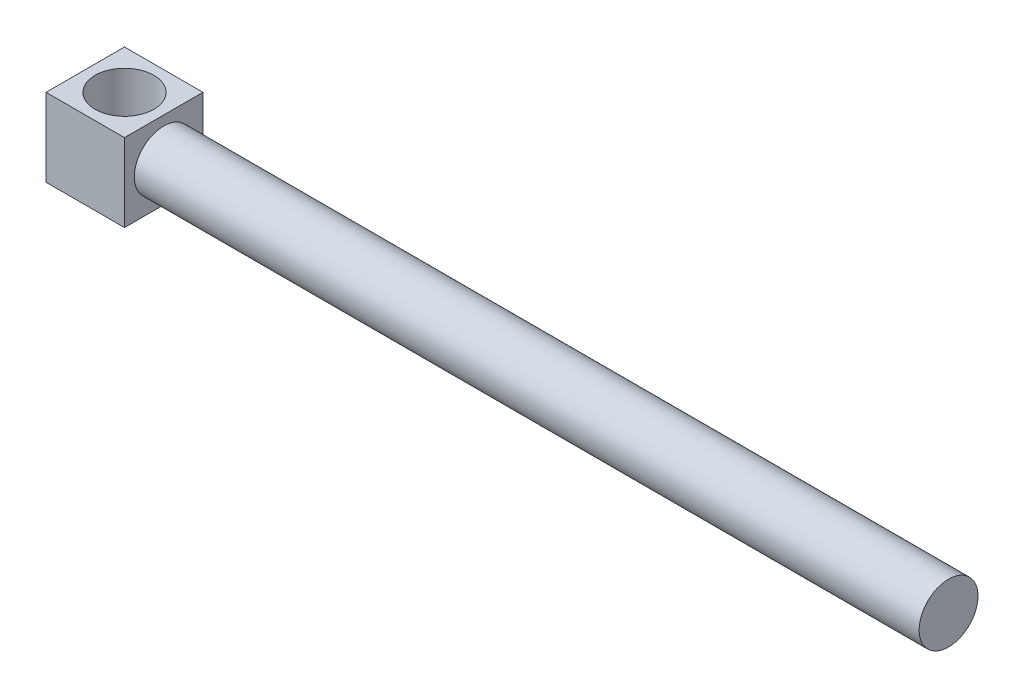
ISO-10303-21;
HEADER;
FILE_DESCRIPTION(('STEP AP214'),'2;1');
FILE_NAME('part.step','',(''),(''),'','','');
FILE_SCHEMA(('AUTOMOTIVE_DESIGN { 1 0 10303 214 1 1 1 1 }'));
ENDSEC;
DATA;
#1=APPLICATION_CONTEXT('core data for automotive mechanical design processes');
#2=APPLICATION_PROTOCOL_DEFINITION('international standard','automotive_design',2000,#1);
#3=PRODUCT_CONTEXT('',#1,'mechanical');
#4=PRODUCT('Part','Part','',(#3));
#5=PRODUCT_RELATED_PRODUCT_CATEGORY('part','',(#4));
#6=PRODUCT_DEFINITION_FORMATION('','',#4);
#7=PRODUCT_DEFINITION_CONTEXT('part definition',#1,'design');
#8=PRODUCT_DEFINITION('design','',#6,#7);
#9=PRODUCT_DEFINITION_SHAPE('','',#8);
#10=(LENGTH_UNIT() NAMED_UNIT(*) SI_UNIT(.MILLI.,.METRE.));
#11=(NAMED_UNIT(*) PLANE_ANGLE_UNIT() SI_UNIT($,.RADIAN.));
#12=(NAMED_UNIT(*) SI_UNIT($,.STERADIAN.) SOLID_ANGLE_UNIT());
#13=UNCERTAINTY_MEASURE_WITH_UNIT(LENGTH_MEASURE(1.E-05),#10,'distance_accuracy_value','');
#14=(GEOMETRIC_REPRESENTATION_CONTEXT(3) GLOBAL_UNCERTAINTY_ASSIGNED_CONTEXT((#13)) GLOBAL_UNIT_ASSIGNED_CONTEXT((#10,
#11,#12)) REPRESENTATION_CONTEXT('',''));
#15=CARTESIAN_POINT('',(0.,0.,0.));
#16=DIRECTION('',(0.,0.,1.));
#17=DIRECTION('',(1.,0.,0.));
#18=AXIS2_PLACEMENT_3D('',#15,#16,#17);
#19=CARTESIAN_POINT('',(20.,0.,0.));
#20=DIRECTION('',(0.,0.,1.));
#21=DIRECTION('',(1.,0.,0.));
#22=AXIS2_PLACEMENT_3D('',#19,#20,#21);
#23=PLANE('',#22);
#24=DIRECTION('',(0.,1.,0.));
#25=VECTOR('',#24,1.);
#26=CARTESIAN_POINT('',(0.,0.,0.));
#27=LINE('',#26,#25);
#28=CARTESIAN_POINT('',(0.,0.,0.));
#29=VERTEX_POINT('',#28);
#30=CARTESIAN_POINT('',(0.,19.8521139898844,0.));
#31=VERTEX_POINT('',#30);
#32=EDGE_CURVE('E107',#29,#31,#27,.T.);
#33=ORIENTED_EDGE('',*,*,#32,.F.);
#34=DIRECTION('',(-1.,0.,0.));
#35=VECTOR('',#34,1.);
#36=CARTESIAN_POINT('',(20.,0.,0.));
#37=LINE('',#36,#35);
#38=CARTESIAN_POINT('',(20.,0.,0.));
#39=VERTEX_POINT('',#38);
#40=EDGE_CURVE('E48',#39,#29,#37,.T.);
#41=ORIENTED_EDGE('',*,*,#40,.F.);
#42=DIRECTION('',(0.,1.,0.));
#43=VECTOR('',#42,1.);
#44=CARTESIAN_POINT('',(20.,0.,0.));
#45=LINE('',#44,#43);
#46=CARTESIAN_POINT('',(20.,19.8521139898844,0.));
#47=VERTEX_POINT('',#46);
#48=EDGE_CURVE('E101',#39,#47,#45,.T.);
#49=ORIENTED_EDGE('',*,*,#48,.T.);
#50=DIRECTION('',(-1.,0.,0.));
#51=VECTOR('',#50,1.);
#52=CARTESIAN_POINT('',(20.,19.8521139898844,0.));
#53=LINE('',#52,#51);
#54=EDGE_CURVE('E42',#47,#31,#53,.T.);
#55=ORIENTED_EDGE('',*,*,#54,.T.);
#56=EDGE_LOOP('',(#33,#41,#49,#55));
#57=FACE_BOUND('',#56,.T.);
#58=ADVANCED_FACE('F39',(#57),#23,.T.);
#59=CARTESIAN_POINT('',(20.,0.,0.));
#60=DIRECTION('',(0.,1.,0.));
#61=DIRECTION('',(0.,0.,1.));
#62=AXIS2_PLACEMENT_3D('',#59,#60,#61);
#63=PLANE('',#62);
#64=CARTESIAN_POINT('',(10.,0.,-10.));
#65=DIRECTION('',(0.,1.,0.));
#66=DIRECTION('',(0.,0.,1.));
#67=AXIS2_PLACEMENT_3D('',#64,#65,#66);
#68=CIRCLE('',#67,7.5);
#69=CARTESIAN_POINT('',(10.,0.,-2.5));
#70=VERTEX_POINT('',#69);
#71=EDGE_CURVE('E111',#70,#70,#68,.T.);
#72=ORIENTED_EDGE('',*,*,#71,.T.);
#73=EDGE_LOOP('',(#72));
#74=FACE_BOUND('',#73,.T.);
#75=DIRECTION('',(0.,0.,-1.));
#76=VECTOR('',#75,1.);
#77=CARTESIAN_POINT('',(0.,0.,0.));
#78=LINE('',#77,#76);
#79=CARTESIAN_POINT('',(0.,0.,-20.));
#80=VERTEX_POINT('',#79);
#81=EDGE_CURVE('E73',#29,#80,#78,.T.);
#82=ORIENTED_EDGE('',*,*,#81,.T.);
#83=DIRECTION('',(-1.,0.,0.));
#84=VECTOR('',#83,1.);
#85=CARTESIAN_POINT('',(20.,0.,-20.));
#86=LINE('',#85,#84);
#87=CARTESIAN_POINT('',(20.,0.,-20.));
#88=VERTEX_POINT('',#87);
#89=EDGE_CURVE('E99',#88,#80,#86,.T.);
#90=ORIENTED_EDGE('',*,*,#89,.F.);
#91=DIRECTION('',(0.,0.,-1.));
#92=VECTOR('',#91,1.);
#93=CARTESIAN_POINT('',(20.,0.,0.));
#94=LINE('',#93,#92);
#95=EDGE_CURVE('E90',#39,#88,#94,.T.);
#96=ORIENTED_EDGE('',*,*,#95,.F.);
#97=ORIENTED_EDGE('',*,*,#40,.T.);
#98=EDGE_LOOP('',(#82,#90,#96,#97));
#99=FACE_BOUND('',#98,.T.);
#100=ADVANCED_FACE('F119',(#74,#99),#63,.F.);
#101=CARTESIAN_POINT('',(20.,0.,-20.));
#102=DIRECTION('',(0.,0.,1.));
#103=DIRECTION('',(1.,0.,0.));
#104=AXIS2_PLACEMENT_3D('',#101,#102,#103);
#105=PLANE('',#104);
#106=DIRECTION('',(0.,1.,0.));
#107=VECTOR('',#106,1.);
#108=CARTESIAN_POINT('',(0.,0.,-20.));
#109=LINE('',#108,#107);
#110=CARTESIAN_POINT('',(0.,19.8521139898844,-20.));
#111=VERTEX_POINT('',#110);
#112=EDGE_CURVE('E97',#80,#111,#109,.T.);
#113=ORIENTED_EDGE('',*,*,#112,.T.);
#114=DIRECTION('',(-1.,0.,0.));
#115=VECTOR('',#114,1.);
#116=CARTESIAN_POINT('',(20.,19.8521139898844,-20.));
#117=LINE('',#116,#115);
#118=CARTESIAN_POINT('',(20.,19.8521139898844,-20.));
#119=VERTEX_POINT('',#118);
#120=EDGE_CURVE('E94',#119,#111,#117,.T.);
#121=ORIENTED_EDGE('',*,*,#120,.F.);
#122=DIRECTION('',(0.,1.,0.));
#123=VECTOR('',#122,1.);
#124=CARTESIAN_POINT('',(20.,0.,-20.));
#125=LINE('',#124,#123);
#126=EDGE_CURVE('E85',#88,#119,#125,.T.);
#127=ORIENTED_EDGE('',*,*,#126,.F.);
#128=ORIENTED_EDGE('',*,*,#89,.T.);
#129=EDGE_LOOP('',(#113,#121,#127,#128));
#130=FACE_BOUND('',#129,.T.);
#131=ADVANCED_FACE('F95',(#130),#105,.F.);
#132=CARTESIAN_POINT('',(20.,19.8521139898844,0.));
#133=DIRECTION('',(0.,1.,0.));
#134=DIRECTION('',(0.,0.,1.));
#135=AXIS2_PLACEMENT_3D('',#132,#133,#134);
#136=PLANE('',#135);
#137=CARTESIAN_POINT('',(10.,19.8521139898844,-10.));
#138=DIRECTION('',(0.,1.,0.));
#139=DIRECTION('',(0.,0.,1.));
#140=AXIS2_PLACEMENT_3D('',#137,#138,#139);
#141=CIRCLE('',#140,7.5);
#142=CARTESIAN_POINT('',(10.,19.8521139898844,-2.5));
#143=VERTEX_POINT('',#142);
#144=EDGE_CURVE('E142',#143,#143,#141,.T.);
#145=ORIENTED_EDGE('',*,*,#144,.F.);
#146=EDGE_LOOP('',(#145));
#147=FACE_BOUND('',#146,.T.);
#148=DIRECTION('',(0.,0.,-1.));
#149=VECTOR('',#148,1.);
#150=CARTESIAN_POINT('',(0.,19.8521139898844,0.));
#151=LINE('',#150,#149);
#152=EDGE_CURVE('E110',#31,#111,#151,.T.);
#153=ORIENTED_EDGE('',*,*,#152,.F.);
#154=ORIENTED_EDGE('',*,*,#54,.F.);
#155=DIRECTION('',(0.,0.,-1.));
#156=VECTOR('',#155,1.);
#157=CARTESIAN_POINT('',(20.,19.8521139898844,0.));
#158=LINE('',#157,#156);
#159=EDGE_CURVE('E89',#47,#119,#158,.T.);
#160=ORIENTED_EDGE('',*,*,#159,.T.);
#161=ORIENTED_EDGE('',*,*,#120,.T.);
#162=EDGE_LOOP('',(#153,#154,#160,#161));
#163=FACE_BOUND('',#162,.T.);
#164=ADVANCED_FACE('F100',(#147,#163),#136,.T.);
#165=CARTESIAN_POINT('',(20.,0.,0.));
#166=DIRECTION('',(-1.,0.,0.));
#167=DIRECTION('',(0.,0.,1.));
#168=AXIS2_PLACEMENT_3D('',#165,#166,#167);
#169=PLANE('',#168);
#170=CARTESIAN_POINT('',(20.,9.9260569949422,-10.));
#171=DIRECTION('',(1.,0.,0.));
#172=DIRECTION('',(0.,0.,-1.));
#173=AXIS2_PLACEMENT_3D('',#170,#171,#172);
#174=CIRCLE('',#173,7.5);
#175=CARTESIAN_POINT('',(20.,9.9260569949422,-17.5));
#176=VERTEX_POINT('',#175);
#177=EDGE_CURVE('E11',#176,#176,#174,.T.);
#178=ORIENTED_EDGE('',*,*,#177,.F.);
#179=EDGE_LOOP('',(#178));
#180=FACE_BOUND('',#179,.T.);
#181=ORIENTED_EDGE('',*,*,#48,.F.);
#182=ORIENTED_EDGE('',*,*,#95,.T.);
#183=ORIENTED_EDGE('',*,*,#126,.T.);
#184=ORIENTED_EDGE('',*,*,#159,.F.);
#185=EDGE_LOOP('',(#181,#182,#183,#184));
#186=FACE_BOUND('',#185,.T.);
#187=ADVANCED_FACE('F88',(#180,#186),#169,.F.);
#188=CARTESIAN_POINT('',(0.,0.,0.));
#189=DIRECTION('',(-1.,0.,0.));
#190=DIRECTION('',(0.,0.,1.));
#191=AXIS2_PLACEMENT_3D('',#188,#189,#190);
#192=PLANE('',#191);
#193=ORIENTED_EDGE('',*,*,#32,.T.);
#194=ORIENTED_EDGE('',*,*,#152,.T.);
#195=ORIENTED_EDGE('',*,*,#112,.F.);
#196=ORIENTED_EDGE('',*,*,#81,.F.);
#197=EDGE_LOOP('',(#193,#194,#195,#196));
#198=FACE_BOUND('',#197,.T.);
#199=ADVANCED_FACE('F117',(#198),#192,.T.);
#200=CARTESIAN_POINT('',(10.,-0.147886010115599,-10.));
#201=DIRECTION('',(0.,1.,0.));
#202=DIRECTION('',(0.,0.,1.));
#203=AXIS2_PLACEMENT_3D('',#200,#201,#202);
#204=CYLINDRICAL_SURFACE('',#203,7.5);
#205=ORIENTED_EDGE('',*,*,#144,.T.);
#206=EDGE_LOOP('',(#205));
#207=FACE_BOUND('',#206,.T.);
#208=ORIENTED_EDGE('',*,*,#71,.F.);
#209=EDGE_LOOP('',(#208));
#210=FACE_BOUND('',#209,.T.);
#211=ADVANCED_FACE('F155',(#207,#210),#204,.F.);
#212=CARTESIAN_POINT('',(220.,9.9260569949422,-10.));
#213=DIRECTION('',(-1.,0.,0.));
#214=DIRECTION('',(0.,0.,1.));
#215=AXIS2_PLACEMENT_3D('',#212,#213,#214);
#216=CYLINDRICAL_SURFACE('',#215,7.5);
#217=CARTESIAN_POINT('',(220.,9.9260569949422,-10.));
#218=DIRECTION('',(1.,0.,0.));
#219=DIRECTION('',(0.,0.,-1.));
#220=AXIS2_PLACEMENT_3D('',#217,#218,#219);
#221=CIRCLE('',#220,7.5);
#222=CARTESIAN_POINT('',(220.,9.9260569949422,-17.5));
#223=VERTEX_POINT('',#222);
#224=EDGE_CURVE('E144',#223,#223,#221,.T.);
#225=ORIENTED_EDGE('',*,*,#224,.F.);
#226=EDGE_LOOP('',(#225));
#227=FACE_BOUND('',#226,.T.);
#228=ORIENTED_EDGE('',*,*,#177,.T.);
#229=EDGE_LOOP('',(#228));
#230=FACE_BOUND('',#229,.T.);
#231=ADVANCED_FACE('F152',(#227,#230),#216,.T.);
#232=CARTESIAN_POINT('',(220.,9.9260569949422,-10.));
#233=DIRECTION('',(1.,0.,0.));
#234=DIRECTION('',(0.,0.,-1.));
#235=AXIS2_PLACEMENT_3D('',#232,#233,#234);
#236=PLANE('',#235);
#237=ORIENTED_EDGE('',*,*,#224,.T.);
#238=EDGE_LOOP('',(#237));
#239=FACE_BOUND('',#238,.T.);
#240=ADVANCED_FACE('F150',(#239),#236,.T.);
#241=CLOSED_SHELL('',(#58,#100,#131,#164,#187,#199,#211,#231,#240));
#242=MANIFOLD_SOLID_BREP('B2',#241);
#243=ADVANCED_BREP_SHAPE_REPRESENTATION('',(#18,#242),#14);
#244=SHAPE_DEFINITION_REPRESENTATION(#9,#243);
ENDSEC;
END-ISO-10303-21;
